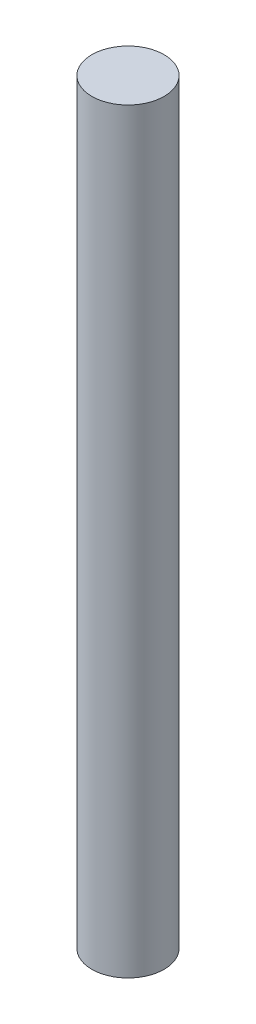
ISO-10303-21;
HEADER;
FILE_DESCRIPTION(('STEP AP214'),'2;1');
FILE_NAME('part.step','',(''),(''),'','','');
FILE_SCHEMA(('AUTOMOTIVE_DESIGN { 1 0 10303 214 1 1 1 1 }'));
ENDSEC;
DATA;
#1=APPLICATION_CONTEXT('core data for automotive mechanical design processes');
#2=APPLICATION_PROTOCOL_DEFINITION('international standard','automotive_design',2000,#1);
#3=PRODUCT_CONTEXT('',#1,'mechanical');
#4=PRODUCT('Part','Part','',(#3));
#5=PRODUCT_RELATED_PRODUCT_CATEGORY('part','',(#4));
#6=PRODUCT_DEFINITION_FORMATION('','',#4);
#7=PRODUCT_DEFINITION_CONTEXT('part definition',#1,'design');
#8=PRODUCT_DEFINITION('design','',#6,#7);
#9=PRODUCT_DEFINITION_SHAPE('','',#8);
#10=(LENGTH_UNIT() NAMED_UNIT(*) SI_UNIT(.MILLI.,.METRE.));
#11=(NAMED_UNIT(*) PLANE_ANGLE_UNIT() SI_UNIT($,.RADIAN.));
#12=(NAMED_UNIT(*) SI_UNIT($,.STERADIAN.) SOLID_ANGLE_UNIT());
#13=UNCERTAINTY_MEASURE_WITH_UNIT(LENGTH_MEASURE(1.E-05),#10,'distance_accuracy_value','');
#14=(GEOMETRIC_REPRESENTATION_CONTEXT(3) GLOBAL_UNCERTAINTY_ASSIGNED_CONTEXT((#13)) GLOBAL_UNIT_ASSIGNED_CONTEXT((#10,
#11,#12)) REPRESENTATION_CONTEXT('',''));
#15=CARTESIAN_POINT('',(0.,0.,0.));
#16=DIRECTION('',(0.,0.,1.));
#17=DIRECTION('',(1.,0.,0.));
#18=AXIS2_PLACEMENT_3D('',#15,#16,#17);
#19=CARTESIAN_POINT('',(0.,166.,0.));
#20=DIRECTION('',(0.,-1.,0.));
#21=DIRECTION('',(0.,0.,-1.));
#22=AXIS2_PLACEMENT_3D('',#19,#20,#21);
#23=CYLINDRICAL_SURFACE('',#22,7.9375);
#24=CARTESIAN_POINT('',(0.,166.,0.));
#25=DIRECTION('',(0.,1.,0.));
#26=DIRECTION('',(0.,0.,1.));
#27=AXIS2_PLACEMENT_3D('',#24,#25,#26);
#28=CIRCLE('',#27,7.9375);
#29=CARTESIAN_POINT('',(0.,166.,7.9375));
#30=VERTEX_POINT('',#29);
#31=EDGE_CURVE('E10',#30,#30,#28,.T.);
#32=ORIENTED_EDGE('',*,*,#31,.F.);
#33=EDGE_LOOP('',(#32));
#34=FACE_BOUND('',#33,.T.);
#35=CARTESIAN_POINT('',(0.,0.,0.));
#36=DIRECTION('',(0.,1.,0.));
#37=DIRECTION('',(0.,0.,1.));
#38=AXIS2_PLACEMENT_3D('',#35,#36,#37);
#39=CIRCLE('',#38,7.9375);
#40=CARTESIAN_POINT('',(0.,0.,7.9375));
#41=VERTEX_POINT('',#40);
#42=EDGE_CURVE('E35',#41,#41,#39,.T.);
#43=ORIENTED_EDGE('',*,*,#42,.T.);
#44=EDGE_LOOP('',(#43));
#45=FACE_BOUND('',#44,.T.);
#46=ADVANCED_FACE('F32',(#34,#45),#23,.T.);
#47=CARTESIAN_POINT('',(0.,166.,0.));
#48=DIRECTION('',(0.,1.,0.));
#49=DIRECTION('',(0.,0.,1.));
#50=AXIS2_PLACEMENT_3D('',#47,#48,#49);
#51=PLANE('',#50);
#52=ORIENTED_EDGE('',*,*,#31,.T.);
#53=EDGE_LOOP('',(#52));
#54=FACE_BOUND('',#53,.T.);
#55=ADVANCED_FACE('F47',(#54),#51,.T.);
#56=CARTESIAN_POINT('',(0.,0.,0.));
#57=DIRECTION('',(0.,1.,0.));
#58=DIRECTION('',(0.,0.,1.));
#59=AXIS2_PLACEMENT_3D('',#56,#57,#58);
#60=PLANE('',#59);
#61=ORIENTED_EDGE('',*,*,#42,.F.);
#62=EDGE_LOOP('',(#61));
#63=FACE_BOUND('',#62,.T.);
#64=ADVANCED_FACE('F45',(#63),#60,.F.);
#65=CLOSED_SHELL('',(#46,#55,#64));
#66=MANIFOLD_SOLID_BREP('B2',#65);
#67=ADVANCED_BREP_SHAPE_REPRESENTATION('',(#18,#66),#14);
#68=SHAPE_DEFINITION_REPRESENTATION(#9,#67);
ENDSEC;
END-ISO-10303-21;
